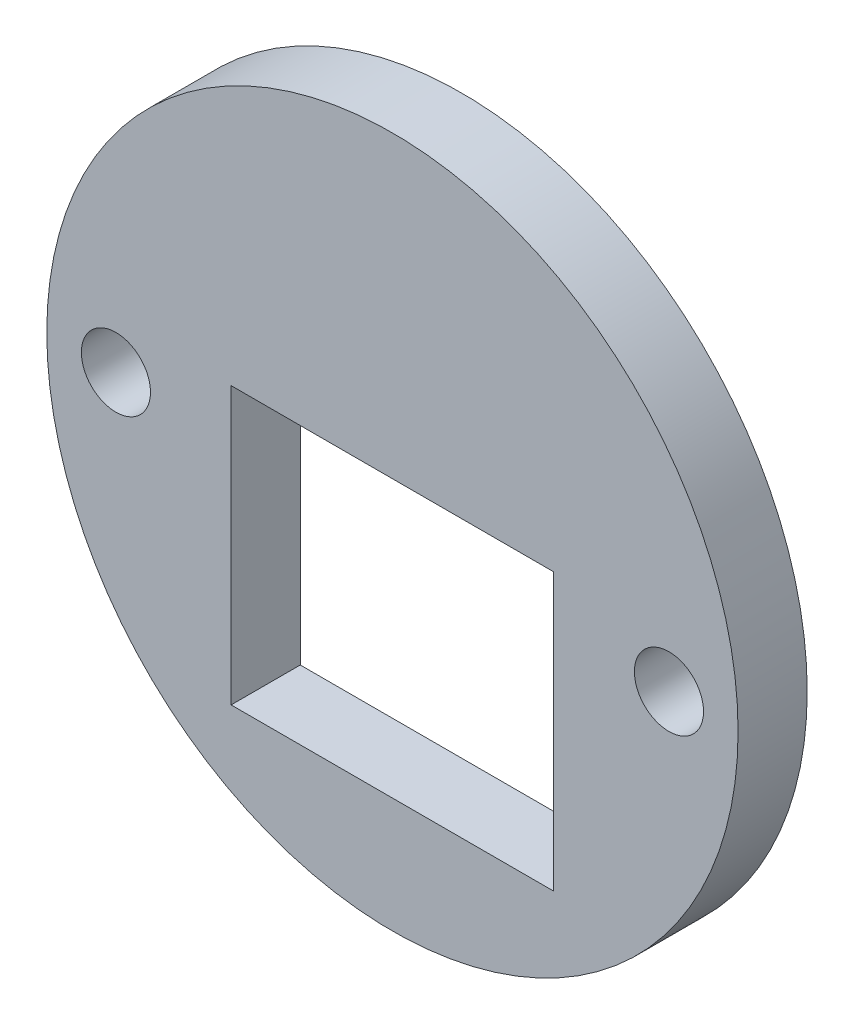
ISO-10303-21;
HEADER;
FILE_DESCRIPTION(('STEP AP214'),'2;1');
FILE_NAME('part.step','',(''),(''),'','','');
FILE_SCHEMA(('AUTOMOTIVE_DESIGN { 1 0 10303 214 1 1 1 1 }'));
ENDSEC;
DATA;
#1=APPLICATION_CONTEXT('core data for automotive mechanical design processes');
#2=APPLICATION_PROTOCOL_DEFINITION('international standard','automotive_design',2000,#1);
#3=PRODUCT_CONTEXT('',#1,'mechanical');
#4=PRODUCT('Part','Part','',(#3));
#5=PRODUCT_RELATED_PRODUCT_CATEGORY('part','',(#4));
#6=PRODUCT_DEFINITION_FORMATION('','',#4);
#7=PRODUCT_DEFINITION_CONTEXT('part definition',#1,'design');
#8=PRODUCT_DEFINITION('design','',#6,#7);
#9=PRODUCT_DEFINITION_SHAPE('','',#8);
#10=(LENGTH_UNIT() NAMED_UNIT(*) SI_UNIT(.MILLI.,.METRE.));
#11=(NAMED_UNIT(*) PLANE_ANGLE_UNIT() SI_UNIT($,.RADIAN.));
#12=(NAMED_UNIT(*) SI_UNIT($,.STERADIAN.) SOLID_ANGLE_UNIT());
#13=UNCERTAINTY_MEASURE_WITH_UNIT(LENGTH_MEASURE(1.E-05),#10,'distance_accuracy_value','');
#14=(GEOMETRIC_REPRESENTATION_CONTEXT(3) GLOBAL_UNCERTAINTY_ASSIGNED_CONTEXT((#13)) GLOBAL_UNIT_ASSIGNED_CONTEXT((#10,
#11,#12)) REPRESENTATION_CONTEXT('',''));
#15=CARTESIAN_POINT('',(0.,0.,0.));
#16=DIRECTION('',(0.,0.,1.));
#17=DIRECTION('',(1.,0.,0.));
#18=AXIS2_PLACEMENT_3D('',#15,#16,#17);
#19=CARTESIAN_POINT('',(0.,0.,3.));
#20=DIRECTION('',(0.,0.,1.));
#21=DIRECTION('',(1.,0.,0.));
#22=AXIS2_PLACEMENT_3D('',#19,#20,#21);
#23=PLANE('',#22);
#24=CARTESIAN_POINT('',(-12.,0.,3.));
#25=DIRECTION('',(0.,0.,1.));
#26=DIRECTION('',(1.,0.,0.));
#27=AXIS2_PLACEMENT_3D('',#24,#25,#26);
#28=CIRCLE('',#27,1.5);
#29=CARTESIAN_POINT('',(-10.5,0.,3.));
#30=VERTEX_POINT('',#29);
#31=EDGE_CURVE('E118',#30,#30,#28,.T.);
#32=ORIENTED_EDGE('',*,*,#31,.F.);
#33=EDGE_LOOP('',(#32));
#34=FACE_BOUND('',#33,.T.);
#35=CARTESIAN_POINT('',(0.,0.,3.));
#36=DIRECTION('',(0.,0.,1.));
#37=DIRECTION('',(1.,0.,0.));
#38=AXIS2_PLACEMENT_3D('',#35,#36,#37);
#39=CIRCLE('',#38,15.);
#40=CARTESIAN_POINT('',(15.,0.,3.));
#41=VERTEX_POINT('',#40);
#42=EDGE_CURVE('E11',#41,#41,#39,.T.);
#43=ORIENTED_EDGE('',*,*,#42,.T.);
#44=EDGE_LOOP('',(#43));
#45=FACE_BOUND('',#44,.T.);
#46=CARTESIAN_POINT('',(12.,0.,3.));
#47=DIRECTION('',(0.,0.,1.));
#48=DIRECTION('',(1.,0.,0.));
#49=AXIS2_PLACEMENT_3D('',#46,#47,#48);
#50=CIRCLE('',#49,1.5);
#51=CARTESIAN_POINT('',(13.5,0.,3.));
#52=VERTEX_POINT('',#51);
#53=EDGE_CURVE('E112',#52,#52,#50,.T.);
#54=ORIENTED_EDGE('',*,*,#53,.F.);
#55=EDGE_LOOP('',(#54));
#56=FACE_BOUND('',#55,.T.);
#57=DIRECTION('',(1.,0.,0.));
#58=VECTOR('',#57,1.);
#59=CARTESIAN_POINT('',(-7.,-10.,3.));
#60=LINE('',#59,#58);
#61=CARTESIAN_POINT('',(-7.,-10.,3.));
#62=VERTEX_POINT('',#61);
#63=CARTESIAN_POINT('',(7.,-10.,3.));
#64=VERTEX_POINT('',#63);
#65=EDGE_CURVE('E84',#62,#64,#60,.T.);
#66=ORIENTED_EDGE('',*,*,#65,.F.);
#67=DIRECTION('',(0.,-1.,0.));
#68=VECTOR('',#67,1.);
#69=CARTESIAN_POINT('',(-7.,2.,3.));
#70=LINE('',#69,#68);
#71=CARTESIAN_POINT('',(-7.,2.,3.));
#72=VERTEX_POINT('',#71);
#73=EDGE_CURVE('E76',#72,#62,#70,.T.);
#74=ORIENTED_EDGE('',*,*,#73,.F.);
#75=DIRECTION('',(-1.,0.,0.));
#76=VECTOR('',#75,1.);
#77=CARTESIAN_POINT('',(-7.,2.,3.));
#78=LINE('',#77,#76);
#79=CARTESIAN_POINT('',(7.,2.,3.));
#80=VERTEX_POINT('',#79);
#81=EDGE_CURVE('E98',#80,#72,#78,.T.);
#82=ORIENTED_EDGE('',*,*,#81,.F.);
#83=DIRECTION('',(0.,1.,0.));
#84=VECTOR('',#83,1.);
#85=CARTESIAN_POINT('',(7.,2.,3.));
#86=LINE('',#85,#84);
#87=EDGE_CURVE('E96',#64,#80,#86,.T.);
#88=ORIENTED_EDGE('',*,*,#87,.F.);
#89=EDGE_LOOP('',(#66,#74,#82,#88));
#90=FACE_BOUND('',#89,.T.);
#91=ADVANCED_FACE('F35',(#34,#45,#56,#90),#23,.T.);
#92=CARTESIAN_POINT('',(0.,0.,0.));
#93=DIRECTION('',(0.,0.,1.));
#94=DIRECTION('',(1.,0.,0.));
#95=AXIS2_PLACEMENT_3D('',#92,#93,#94);
#96=PLANE('',#95);
#97=CARTESIAN_POINT('',(12.,0.,0.));
#98=DIRECTION('',(0.,0.,1.));
#99=DIRECTION('',(1.,0.,0.));
#100=AXIS2_PLACEMENT_3D('',#97,#98,#99);
#101=CIRCLE('',#100,1.5);
#102=CARTESIAN_POINT('',(13.5,0.,0.));
#103=VERTEX_POINT('',#102);
#104=EDGE_CURVE('E92',#103,#103,#101,.T.);
#105=ORIENTED_EDGE('',*,*,#104,.T.);
#106=EDGE_LOOP('',(#105));
#107=FACE_BOUND('',#106,.T.);
#108=CARTESIAN_POINT('',(-12.,0.,0.));
#109=DIRECTION('',(0.,0.,1.));
#110=DIRECTION('',(1.,0.,0.));
#111=AXIS2_PLACEMENT_3D('',#108,#109,#110);
#112=CIRCLE('',#111,1.5);
#113=CARTESIAN_POINT('',(-10.5,0.,0.));
#114=VERTEX_POINT('',#113);
#115=EDGE_CURVE('E115',#114,#114,#112,.T.);
#116=ORIENTED_EDGE('',*,*,#115,.T.);
#117=EDGE_LOOP('',(#116));
#118=FACE_BOUND('',#117,.T.);
#119=CARTESIAN_POINT('',(0.,0.,0.));
#120=DIRECTION('',(0.,0.,1.));
#121=DIRECTION('',(1.,0.,0.));
#122=AXIS2_PLACEMENT_3D('',#119,#120,#121);
#123=CIRCLE('',#122,15.);
#124=CARTESIAN_POINT('',(15.,0.,0.));
#125=VERTEX_POINT('',#124);
#126=EDGE_CURVE('E39',#125,#125,#123,.T.);
#127=ORIENTED_EDGE('',*,*,#126,.F.);
#128=EDGE_LOOP('',(#127));
#129=FACE_BOUND('',#128,.T.);
#130=DIRECTION('',(0.,-1.,0.));
#131=VECTOR('',#130,1.);
#132=CARTESIAN_POINT('',(-7.,2.,0.));
#133=LINE('',#132,#131);
#134=CARTESIAN_POINT('',(-7.,2.,0.));
#135=VERTEX_POINT('',#134);
#136=CARTESIAN_POINT('',(-7.,-10.,0.));
#137=VERTEX_POINT('',#136);
#138=EDGE_CURVE('E58',#135,#137,#133,.T.);
#139=ORIENTED_EDGE('',*,*,#138,.T.);
#140=DIRECTION('',(1.,0.,0.));
#141=VECTOR('',#140,1.);
#142=CARTESIAN_POINT('',(-7.,-10.,0.));
#143=LINE('',#142,#141);
#144=CARTESIAN_POINT('',(7.,-10.,0.));
#145=VERTEX_POINT('',#144);
#146=EDGE_CURVE('E91',#137,#145,#143,.T.);
#147=ORIENTED_EDGE('',*,*,#146,.T.);
#148=DIRECTION('',(0.,1.,0.));
#149=VECTOR('',#148,1.);
#150=CARTESIAN_POINT('',(7.,2.,0.));
#151=LINE('',#150,#149);
#152=CARTESIAN_POINT('',(7.,2.,0.));
#153=VERTEX_POINT('',#152);
#154=EDGE_CURVE('E104',#145,#153,#151,.T.);
#155=ORIENTED_EDGE('',*,*,#154,.T.);
#156=DIRECTION('',(-1.,0.,0.));
#157=VECTOR('',#156,1.);
#158=CARTESIAN_POINT('',(-7.,2.,0.));
#159=LINE('',#158,#157);
#160=EDGE_CURVE('E85',#153,#135,#159,.T.);
#161=ORIENTED_EDGE('',*,*,#160,.T.);
#162=EDGE_LOOP('',(#139,#147,#155,#161));
#163=FACE_BOUND('',#162,.T.);
#164=ADVANCED_FACE('F124',(#107,#118,#129,#163),#96,.F.);
#165=CARTESIAN_POINT('',(0.,0.,3.));
#166=DIRECTION('',(0.,0.,-1.));
#167=DIRECTION('',(-1.,0.,0.));
#168=AXIS2_PLACEMENT_3D('',#165,#166,#167);
#169=CYLINDRICAL_SURFACE('',#168,15.);
#170=ORIENTED_EDGE('',*,*,#42,.F.);
#171=EDGE_LOOP('',(#170));
#172=FACE_BOUND('',#171,.T.);
#173=ORIENTED_EDGE('',*,*,#126,.T.);
#174=EDGE_LOOP('',(#173));
#175=FACE_BOUND('',#174,.T.);
#176=ADVANCED_FACE('F37',(#172,#175),#169,.T.);
#177=CARTESIAN_POINT('',(-12.,0.,3.));
#178=DIRECTION('',(0.,0.,-1.));
#179=DIRECTION('',(-1.,0.,0.));
#180=AXIS2_PLACEMENT_3D('',#177,#178,#179);
#181=CYLINDRICAL_SURFACE('',#180,1.5);
#182=ORIENTED_EDGE('',*,*,#31,.T.);
#183=EDGE_LOOP('',(#182));
#184=FACE_BOUND('',#183,.T.);
#185=ORIENTED_EDGE('',*,*,#115,.F.);
#186=EDGE_LOOP('',(#185));
#187=FACE_BOUND('',#186,.T.);
#188=ADVANCED_FACE('F127',(#184,#187),#181,.F.);
#189=CARTESIAN_POINT('',(12.,0.,3.));
#190=DIRECTION('',(0.,0.,-1.));
#191=DIRECTION('',(-1.,0.,0.));
#192=AXIS2_PLACEMENT_3D('',#189,#190,#191);
#193=CYLINDRICAL_SURFACE('',#192,1.5);
#194=ORIENTED_EDGE('',*,*,#53,.T.);
#195=EDGE_LOOP('',(#194));
#196=FACE_BOUND('',#195,.T.);
#197=ORIENTED_EDGE('',*,*,#104,.F.);
#198=EDGE_LOOP('',(#197));
#199=FACE_BOUND('',#198,.T.);
#200=ADVANCED_FACE('F129',(#196,#199),#193,.F.);
#201=CARTESIAN_POINT('',(-7.,2.,3.));
#202=DIRECTION('',(1.,0.,0.));
#203=DIRECTION('',(0.,1.,0.));
#204=AXIS2_PLACEMENT_3D('',#201,#202,#203);
#205=PLANE('',#204);
#206=ORIENTED_EDGE('',*,*,#138,.F.);
#207=DIRECTION('',(0.,0.,-1.));
#208=VECTOR('',#207,1.);
#209=CARTESIAN_POINT('',(-7.,2.,3.));
#210=LINE('',#209,#208);
#211=EDGE_CURVE('E80',#72,#135,#210,.T.);
#212=ORIENTED_EDGE('',*,*,#211,.F.);
#213=ORIENTED_EDGE('',*,*,#73,.T.);
#214=DIRECTION('',(0.,0.,-1.));
#215=VECTOR('',#214,1.);
#216=CARTESIAN_POINT('',(-7.,-10.,3.));
#217=LINE('',#216,#215);
#218=EDGE_CURVE('E79',#62,#137,#217,.T.);
#219=ORIENTED_EDGE('',*,*,#218,.T.);
#220=EDGE_LOOP('',(#206,#212,#213,#219));
#221=FACE_BOUND('',#220,.T.);
#222=ADVANCED_FACE('F78',(#221),#205,.T.);
#223=CARTESIAN_POINT('',(-7.,-10.,3.));
#224=DIRECTION('',(0.,1.,0.));
#225=DIRECTION('',(0.,0.,1.));
#226=AXIS2_PLACEMENT_3D('',#223,#224,#225);
#227=PLANE('',#226);
#228=ORIENTED_EDGE('',*,*,#146,.F.);
#229=ORIENTED_EDGE('',*,*,#218,.F.);
#230=ORIENTED_EDGE('',*,*,#65,.T.);
#231=DIRECTION('',(0.,0.,-1.));
#232=VECTOR('',#231,1.);
#233=CARTESIAN_POINT('',(7.,-10.,3.));
#234=LINE('',#233,#232);
#235=EDGE_CURVE('E93',#64,#145,#234,.T.);
#236=ORIENTED_EDGE('',*,*,#235,.T.);
#237=EDGE_LOOP('',(#228,#229,#230,#236));
#238=FACE_BOUND('',#237,.T.);
#239=ADVANCED_FACE('F88',(#238),#227,.T.);
#240=CARTESIAN_POINT('',(7.,2.,3.));
#241=DIRECTION('',(-1.,0.,0.));
#242=DIRECTION('',(0.,-1.,0.));
#243=AXIS2_PLACEMENT_3D('',#240,#241,#242);
#244=PLANE('',#243);
#245=ORIENTED_EDGE('',*,*,#154,.F.);
#246=ORIENTED_EDGE('',*,*,#235,.F.);
#247=ORIENTED_EDGE('',*,*,#87,.T.);
#248=DIRECTION('',(0.,0.,-1.));
#249=VECTOR('',#248,1.);
#250=CARTESIAN_POINT('',(7.,2.,3.));
#251=LINE('',#250,#249);
#252=EDGE_CURVE('E50',#80,#153,#251,.T.);
#253=ORIENTED_EDGE('',*,*,#252,.T.);
#254=EDGE_LOOP('',(#245,#246,#247,#253));
#255=FACE_BOUND('',#254,.T.);
#256=ADVANCED_FACE('F160',(#255),#244,.T.);
#257=CARTESIAN_POINT('',(-7.,2.,3.));
#258=DIRECTION('',(0.,-1.,0.));
#259=DIRECTION('',(0.,0.,-1.));
#260=AXIS2_PLACEMENT_3D('',#257,#258,#259);
#261=PLANE('',#260);
#262=ORIENTED_EDGE('',*,*,#160,.F.);
#263=ORIENTED_EDGE('',*,*,#252,.F.);
#264=ORIENTED_EDGE('',*,*,#81,.T.);
#265=ORIENTED_EDGE('',*,*,#211,.T.);
#266=EDGE_LOOP('',(#262,#263,#264,#265));
#267=FACE_BOUND('',#266,.T.);
#268=ADVANCED_FACE('F158',(#267),#261,.T.);
#269=CLOSED_SHELL('',(#91,#164,#176,#188,#200,#222,#239,#256,#268));
#270=MANIFOLD_SOLID_BREP('B2',#269);
#271=ADVANCED_BREP_SHAPE_REPRESENTATION('',(#18,#270),#14);
#272=SHAPE_DEFINITION_REPRESENTATION(#9,#271);
ENDSEC;
END-ISO-10303-21;
